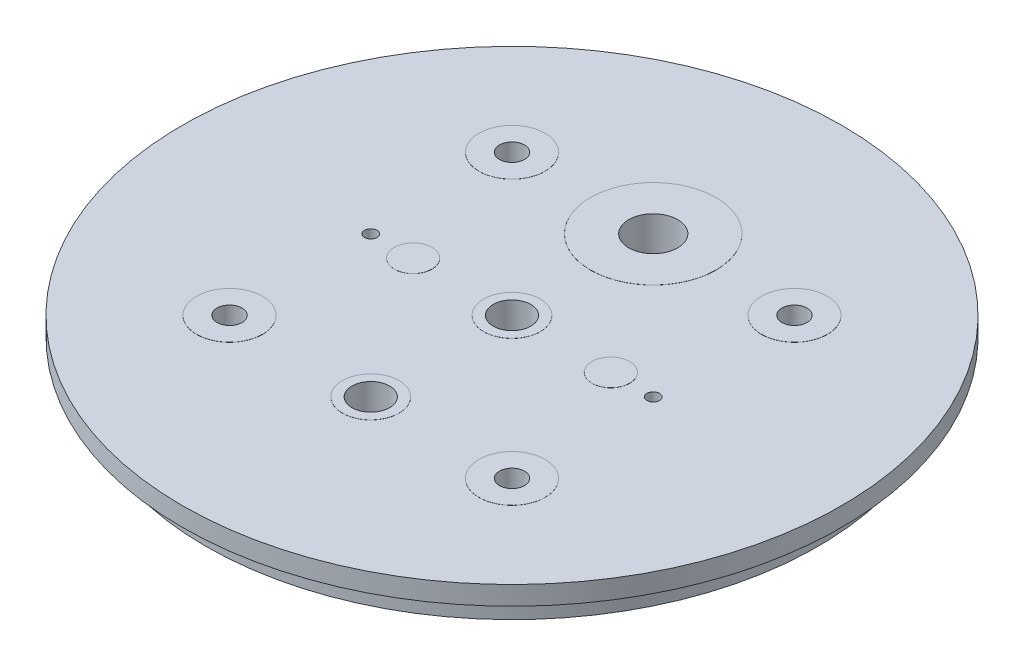
ISO-10303-21;
HEADER;
FILE_DESCRIPTION(('STEP AP214'),'2;1');
FILE_NAME('part.step','',(''),(''),'','','');
FILE_SCHEMA(('AUTOMOTIVE_DESIGN { 1 0 10303 214 1 1 1 1 }'));
ENDSEC;
DATA;
#1=APPLICATION_CONTEXT('core data for automotive mechanical design processes');
#2=APPLICATION_PROTOCOL_DEFINITION('international standard','automotive_design',2000,#1);
#3=PRODUCT_CONTEXT('',#1,'mechanical');
#4=PRODUCT('Part','Part','',(#3));
#5=PRODUCT_RELATED_PRODUCT_CATEGORY('part','',(#4));
#6=PRODUCT_DEFINITION_FORMATION('','',#4);
#7=PRODUCT_DEFINITION_CONTEXT('part definition',#1,'design');
#8=PRODUCT_DEFINITION('design','',#6,#7);
#9=PRODUCT_DEFINITION_SHAPE('','',#8);
#10=(LENGTH_UNIT() NAMED_UNIT(*) SI_UNIT(.MILLI.,.METRE.));
#11=(NAMED_UNIT(*) PLANE_ANGLE_UNIT() SI_UNIT($,.RADIAN.));
#12=(NAMED_UNIT(*) SI_UNIT($,.STERADIAN.) SOLID_ANGLE_UNIT());
#13=UNCERTAINTY_MEASURE_WITH_UNIT(LENGTH_MEASURE(1.E-05),#10,'distance_accuracy_value','');
#14=(GEOMETRIC_REPRESENTATION_CONTEXT(3) GLOBAL_UNCERTAINTY_ASSIGNED_CONTEXT((#13)) GLOBAL_UNIT_ASSIGNED_CONTEXT((#10,
#11,#12)) REPRESENTATION_CONTEXT('',''));
#15=CARTESIAN_POINT('',(0.,0.,0.));
#16=DIRECTION('',(0.,0.,1.));
#17=DIRECTION('',(1.,0.,0.));
#18=AXIS2_PLACEMENT_3D('',#15,#16,#17);
#19=CARTESIAN_POINT('',(-0.000317950413374372,18.7233240058903,10.3432985126634));
#20=DIRECTION('',(0.,-1.,0.));
#21=DIRECTION('',(0.,0.,-1.));
#22=AXIS2_PLACEMENT_3D('',#19,#20,#21);
#23=PLANE('',#22);
#24=CARTESIAN_POINT('',(22.4996823848627,18.7233240058903,-0.15670164379878));
#25=DIRECTION('',(0.,-1.,0.));
#26=DIRECTION('',(1.,0.,0.));
#27=AXIS2_PLACEMENT_3D('',#24,#25,#26);
#28=CIRCLE('',#27,2.);
#29=CARTESIAN_POINT('',(24.4996823848627,18.7233240058903,-0.15670164379878));
#30=VERTEX_POINT('',#29);
#31=EDGE_CURVE('E245',#30,#30,#28,.T.);
#32=ORIENTED_EDGE('',*,*,#31,.F.);
#33=EDGE_LOOP('',(#32));
#34=FACE_BOUND('',#33,.T.);
#35=CARTESIAN_POINT('',(22.4996823848627,18.7233240058903,22.3432986914773));
#36=DIRECTION('',(0.,-1.,0.));
#37=DIRECTION('',(1.,0.,0.));
#38=AXIS2_PLACEMENT_3D('',#35,#36,#37);
#39=CIRCLE('',#38,3.5);
#40=CARTESIAN_POINT('',(25.9996823848627,18.7233240058903,22.3432986914773));
#41=VERTEX_POINT('',#40);
#42=EDGE_CURVE('E249',#41,#41,#39,.T.);
#43=ORIENTED_EDGE('',*,*,#42,.F.);
#44=EDGE_LOOP('',(#43));
#45=FACE_BOUND('',#44,.T.);
#46=CARTESIAN_POINT('',(-22.5003182856895,18.7233240058903,22.3432986914773));
#47=DIRECTION('',(0.,-1.,0.));
#48=DIRECTION('',(1.,0.,0.));
#49=AXIS2_PLACEMENT_3D('',#46,#47,#48);
#50=CIRCLE('',#49,3.5);
#51=CARTESIAN_POINT('',(-19.0003182856895,18.7233240058903,22.3432986914773));
#52=VERTEX_POINT('',#51);
#53=EDGE_CURVE('E261',#52,#52,#50,.T.);
#54=ORIENTED_EDGE('',*,*,#53,.F.);
#55=EDGE_LOOP('',(#54));
#56=FACE_BOUND('',#55,.T.);
#57=CARTESIAN_POINT('',(-22.5003182856895,18.7233240058903,-22.6567019790749));
#58=DIRECTION('',(0.,-1.,0.));
#59=DIRECTION('',(1.,0.,0.));
#60=AXIS2_PLACEMENT_3D('',#57,#58,#59);
#61=CIRCLE('',#60,3.5);
#62=CARTESIAN_POINT('',(-19.0003182856895,18.7233240058903,-22.6567019790749));
#63=VERTEX_POINT('',#62);
#64=EDGE_CURVE('E255',#63,#63,#61,.T.);
#65=ORIENTED_EDGE('',*,*,#64,.F.);
#66=EDGE_LOOP('',(#65));
#67=FACE_BOUND('',#66,.T.);
#68=CARTESIAN_POINT('',(22.4996823848627,18.7233240058903,-22.6567019790749));
#69=DIRECTION('',(0.,-1.,0.));
#70=DIRECTION('',(1.,0.,0.));
#71=AXIS2_PLACEMENT_3D('',#68,#69,#70);
#72=CIRCLE('',#71,3.5);
#73=CARTESIAN_POINT('',(25.9996823848627,18.7233240058903,-22.6567019790749));
#74=VERTEX_POINT('',#73);
#75=EDGE_CURVE('E156',#74,#74,#72,.T.);
#76=ORIENTED_EDGE('',*,*,#75,.F.);
#77=EDGE_LOOP('',(#76));
#78=FACE_BOUND('',#77,.T.);
#79=CARTESIAN_POINT('',(-0.000317950413380542,18.7233240058903,22.3432986914773));
#80=DIRECTION('',(0.,-1.,0.));
#81=DIRECTION('',(1.,0.,0.));
#82=AXIS2_PLACEMENT_3D('',#79,#80,#81);
#83=CIRCLE('',#82,3.);
#84=CARTESIAN_POINT('',(2.99968204958662,18.7233240058903,22.3432986914773));
#85=VERTEX_POINT('',#84);
#86=EDGE_CURVE('E124',#85,#85,#83,.F.);
#87=ORIENTED_EDGE('',*,*,#86,.T.);
#88=EDGE_LOOP('',(#87));
#89=FACE_BOUND('',#88,.T.);
#90=CARTESIAN_POINT('',(-0.00031795041337055,18.7233240058903,-22.6567016437988));
#91=DIRECTION('',(0.,-1.,0.));
#92=DIRECTION('',(1.,0.,0.));
#93=AXIS2_PLACEMENT_3D('',#90,#91,#92);
#94=CIRCLE('',#93,3.9);
#95=CARTESIAN_POINT('',(3.89968204958663,18.7233240058903,-22.6567016437988));
#96=VERTEX_POINT('',#95);
#97=EDGE_CURVE('E116',#96,#96,#94,.F.);
#98=ORIENTED_EDGE('',*,*,#97,.T.);
#99=EDGE_LOOP('',(#98));
#100=FACE_BOUND('',#99,.T.);
#101=CARTESIAN_POINT('',(-0.00031795041337204,18.7233240058902,-0.15670164379878));
#102=DIRECTION('',(0.,-1.,0.));
#103=DIRECTION('',(0.,0.,1.));
#104=AXIS2_PLACEMENT_3D('',#101,#102,#103);
#105=CIRCLE('',#104,48.7499989103526);
#106=CARTESIAN_POINT('',(-0.000317950413355245,18.7233240058902,-48.9067005541514));
#107=VERTEX_POINT('',#106);
#108=EDGE_CURVE('E109',#107,#107,#105,.T.);
#109=ORIENTED_EDGE('',*,*,#108,.T.);
#110=EDGE_LOOP('',(#109));
#111=FACE_BOUND('',#110,.T.);
#112=CARTESIAN_POINT('',(-0.00031795041337204,18.7233240058903,-0.15670164379878));
#113=DIRECTION('',(0.,-1.,0.));
#114=DIRECTION('',(0.,0.,1.));
#115=AXIS2_PLACEMENT_3D('',#112,#113,#114);
#116=CIRCLE('',#115,10.5000001564622);
#117=CARTESIAN_POINT('',(-0.000317950413368423,18.7233240058903,-10.656701800261));
#118=VERTEX_POINT('',#117);
#119=EDGE_CURVE('E103',#118,#118,#116,.T.);
#120=ORIENTED_EDGE('',*,*,#119,.F.);
#121=EDGE_LOOP('',(#120));
#122=FACE_BOUND('',#121,.T.);
#123=CARTESIAN_POINT('',(-22.5003182856895,18.7233240058903,-0.15670164379878));
#124=DIRECTION('',(0.,-1.,0.));
#125=DIRECTION('',(1.,0.,0.));
#126=AXIS2_PLACEMENT_3D('',#123,#124,#125);
#127=CIRCLE('',#126,2.);
#128=CARTESIAN_POINT('',(-20.5003182856895,18.7233240058903,-0.15670164379878));
#129=VERTEX_POINT('',#128);
#130=EDGE_CURVE('E232',#129,#129,#127,.T.);
#131=ORIENTED_EDGE('',*,*,#130,.F.);
#132=EDGE_LOOP('',(#131));
#133=FACE_BOUND('',#132,.T.);
#134=ADVANCED_FACE('F45',(#34,#45,#56,#67,#78,#89,#100,#111,#122,#133),#23,.T.);
#135=CARTESIAN_POINT('',(22.4996823848627,36.2233266135934,22.3432986914773));
#136=DIRECTION('',(0.,-1.,0.));
#137=DIRECTION('',(0.,0.,-1.));
#138=AXIS2_PLACEMENT_3D('',#135,#136,#137);
#139=CYLINDRICAL_SURFACE('',#138,2.);
#140=CARTESIAN_POINT('',(22.4996823848627,26.2423537848137,22.3432986914773));
#141=DIRECTION('',(0.,-1.,0.));
#142=DIRECTION('',(1.,0.,0.));
#143=AXIS2_PLACEMENT_3D('',#140,#141,#142);
#144=CIRCLE('',#143,2.);
#145=CARTESIAN_POINT('',(24.4996823848627,26.2423537848137,22.3432986914773));
#146=VERTEX_POINT('',#145);
#147=EDGE_CURVE('E118',#146,#146,#144,.F.);
#148=ORIENTED_EDGE('',*,*,#147,.T.);
#149=EDGE_LOOP('',(#148));
#150=FACE_BOUND('',#149,.T.);
#151=CARTESIAN_POINT('',(22.4996823848627,20.7233240058903,22.3432986914773));
#152=DIRECTION('',(0.,-1.,0.));
#153=DIRECTION('',(1.,0.,0.));
#154=AXIS2_PLACEMENT_3D('',#151,#152,#153);
#155=CIRCLE('',#154,2.);
#156=CARTESIAN_POINT('',(24.4996823848627,20.7233240058903,22.3432986914773));
#157=VERTEX_POINT('',#156);
#158=EDGE_CURVE('E49',#157,#157,#155,.T.);
#159=ORIENTED_EDGE('',*,*,#158,.T.);
#160=EDGE_LOOP('',(#159));
#161=FACE_BOUND('',#160,.T.);
#162=ADVANCED_FACE('F227',(#150,#161),#139,.F.);
#163=CARTESIAN_POINT('',(-22.5003182856895,36.2233266135934,22.3432986914773));
#164=DIRECTION('',(0.,-1.,0.));
#165=DIRECTION('',(0.,0.,-1.));
#166=AXIS2_PLACEMENT_3D('',#163,#164,#165);
#167=CYLINDRICAL_SURFACE('',#166,2.);
#168=CARTESIAN_POINT('',(-22.5003182856895,26.2423537848136,22.3432986914773));
#169=DIRECTION('',(0.,-1.,0.));
#170=DIRECTION('',(1.,0.,0.));
#171=AXIS2_PLACEMENT_3D('',#168,#169,#170);
#172=CIRCLE('',#171,2.);
#173=CARTESIAN_POINT('',(-20.5003182856895,26.2423537848136,22.3432986914773));
#174=VERTEX_POINT('',#173);
#175=EDGE_CURVE('E125',#174,#174,#172,.F.);
#176=ORIENTED_EDGE('',*,*,#175,.T.);
#177=EDGE_LOOP('',(#176));
#178=FACE_BOUND('',#177,.T.);
#179=CARTESIAN_POINT('',(-22.5003182856895,20.7233240058903,22.3432986914773));
#180=DIRECTION('',(0.,-1.,0.));
#181=DIRECTION('',(1.,0.,0.));
#182=AXIS2_PLACEMENT_3D('',#179,#180,#181);
#183=CIRCLE('',#182,2.);
#184=CARTESIAN_POINT('',(-20.5003182856895,20.7233240058903,22.3432986914773));
#185=VERTEX_POINT('',#184);
#186=EDGE_CURVE('E141',#185,#185,#183,.T.);
#187=ORIENTED_EDGE('',*,*,#186,.T.);
#188=EDGE_LOOP('',(#187));
#189=FACE_BOUND('',#188,.T.);
#190=ADVANCED_FACE('F717',(#178,#189),#167,.F.);
#191=CARTESIAN_POINT('',(-22.5003182856895,36.2233266135934,-22.6567019790749));
#192=DIRECTION('',(0.,-1.,0.));
#193=DIRECTION('',(0.,0.,-1.));
#194=AXIS2_PLACEMENT_3D('',#191,#192,#193);
#195=CYLINDRICAL_SURFACE('',#194,2.);
#196=CARTESIAN_POINT('',(-22.5003182856895,26.2423537848136,-22.6567019790749));
#197=DIRECTION('',(0.,-1.,0.));
#198=DIRECTION('',(1.,0.,0.));
#199=AXIS2_PLACEMENT_3D('',#196,#197,#198);
#200=CIRCLE('',#199,2.);
#201=CARTESIAN_POINT('',(-20.5003182856895,26.2423537848136,-22.6567019790749));
#202=VERTEX_POINT('',#201);
#203=EDGE_CURVE('E128',#202,#202,#200,.F.);
#204=ORIENTED_EDGE('',*,*,#203,.T.);
#205=EDGE_LOOP('',(#204));
#206=FACE_BOUND('',#205,.T.);
#207=CARTESIAN_POINT('',(-22.5003182856895,20.7233240058903,-22.6567019790749));
#208=DIRECTION('',(0.,-1.,0.));
#209=DIRECTION('',(1.,0.,0.));
#210=AXIS2_PLACEMENT_3D('',#207,#208,#209);
#211=CIRCLE('',#210,2.);
#212=CARTESIAN_POINT('',(-20.5003182856895,20.7233240058903,-22.6567019790749));
#213=VERTEX_POINT('',#212);
#214=EDGE_CURVE('E138',#213,#213,#211,.T.);
#215=ORIENTED_EDGE('',*,*,#214,.T.);
#216=EDGE_LOOP('',(#215));
#217=FACE_BOUND('',#216,.T.);
#218=ADVANCED_FACE('F708',(#206,#217),#195,.F.);
#219=CARTESIAN_POINT('',(22.4996823848627,36.2233266135934,-22.6567019790749));
#220=DIRECTION('',(0.,-1.,0.));
#221=DIRECTION('',(0.,0.,-1.));
#222=AXIS2_PLACEMENT_3D('',#219,#220,#221);
#223=CYLINDRICAL_SURFACE('',#222,2.);
#224=CARTESIAN_POINT('',(22.4996823848627,26.2423537848137,-22.6567019790749));
#225=DIRECTION('',(0.,-1.,0.));
#226=DIRECTION('',(1.,0.,0.));
#227=AXIS2_PLACEMENT_3D('',#224,#225,#226);
#228=CIRCLE('',#227,2.);
#229=CARTESIAN_POINT('',(24.4996823848627,26.2423537848137,-22.6567019790749));
#230=VERTEX_POINT('',#229);
#231=EDGE_CURVE('E131',#230,#230,#228,.F.);
#232=ORIENTED_EDGE('',*,*,#231,.T.);
#233=EDGE_LOOP('',(#232));
#234=FACE_BOUND('',#233,.T.);
#235=CARTESIAN_POINT('',(22.4996823848627,20.7233240058903,-22.6567019790749));
#236=DIRECTION('',(0.,-1.,0.));
#237=DIRECTION('',(1.,0.,0.));
#238=AXIS2_PLACEMENT_3D('',#235,#236,#237);
#239=CIRCLE('',#238,2.);
#240=CARTESIAN_POINT('',(24.4996823848627,20.7233240058903,-22.6567019790749));
#241=VERTEX_POINT('',#240);
#242=EDGE_CURVE('E135',#241,#241,#239,.T.);
#243=ORIENTED_EDGE('',*,*,#242,.T.);
#244=EDGE_LOOP('',(#243));
#245=FACE_BOUND('',#244,.T.);
#246=ADVANCED_FACE('F308',(#234,#245),#223,.F.);
#247=CARTESIAN_POINT('',(-0.000317950413387203,26.2233266135934,52.3432991385121));
#248=DIRECTION('',(0.,1.,0.));
#249=DIRECTION('',(1.,0.,0.));
#250=AXIS2_PLACEMENT_3D('',#247,#248,#249);
#251=PLANE('',#250);
#252=CARTESIAN_POINT('',(-22.5003182856895,26.2233266135934,-0.15670164379878));
#253=DIRECTION('',(0.,1.,0.));
#254=DIRECTION('',(0.,0.,1.));
#255=AXIS2_PLACEMENT_3D('',#252,#253,#254);
#256=CIRCLE('',#255,1.);
#257=CARTESIAN_POINT('',(-22.5003182856895,26.2233266135934,0.843298356201221));
#258=VERTEX_POINT('',#257);
#259=EDGE_CURVE('E165',#258,#258,#256,.F.);
#260=ORIENTED_EDGE('',*,*,#259,.T.);
#261=EDGE_LOOP('',(#260));
#262=FACE_BOUND('',#261,.T.);
#263=CARTESIAN_POINT('',(22.4996823848627,26.2233266135934,-0.15670164379878));
#264=DIRECTION('',(0.,1.,0.));
#265=DIRECTION('',(0.,0.,1.));
#266=AXIS2_PLACEMENT_3D('',#263,#264,#265);
#267=CIRCLE('',#266,1.);
#268=CARTESIAN_POINT('',(22.4996823848627,26.2233266135934,0.843298356201221));
#269=VERTEX_POINT('',#268);
#270=EDGE_CURVE('E134',#269,#269,#267,.F.);
#271=ORIENTED_EDGE('',*,*,#270,.T.);
#272=EDGE_LOOP('',(#271));
#273=FACE_BOUND('',#272,.T.);
#274=CARTESIAN_POINT('',(-0.00031795041337055,26.2233266135934,-22.6567016437988));
#275=DIRECTION('',(0.,1.,0.));
#276=DIRECTION('',(0.,0.,1.));
#277=AXIS2_PLACEMENT_3D('',#274,#275,#276);
#278=CIRCLE('',#277,10.);
#279=CARTESIAN_POINT('',(-0.00031795041337055,26.2233266135934,-12.6567016437988));
#280=VERTEX_POINT('',#279);
#281=EDGE_CURVE('E11',#280,#280,#278,.T.);
#282=ORIENTED_EDGE('',*,*,#281,.F.);
#283=EDGE_LOOP('',(#282));
#284=FACE_BOUND('',#283,.T.);
#285=CARTESIAN_POINT('',(22.4996823848627,26.2233266135934,22.3432986914773));
#286=DIRECTION('',(0.,1.,0.));
#287=DIRECTION('',(0.,0.,1.));
#288=AXIS2_PLACEMENT_3D('',#285,#286,#287);
#289=CIRCLE('',#288,5.25);
#290=CARTESIAN_POINT('',(22.4996823848627,26.2233266135934,27.5932986914773));
#291=VERTEX_POINT('',#290);
#292=EDGE_CURVE('E55',#291,#291,#289,.T.);
#293=ORIENTED_EDGE('',*,*,#292,.F.);
#294=EDGE_LOOP('',(#293));
#295=FACE_BOUND('',#294,.T.);
#296=CARTESIAN_POINT('',(-22.5003182856895,26.2233266135934,22.3432986914773));
#297=DIRECTION('',(0.,1.,0.));
#298=DIRECTION('',(0.,0.,1.));
#299=AXIS2_PLACEMENT_3D('',#296,#297,#298);
#300=CIRCLE('',#299,5.25);
#301=CARTESIAN_POINT('',(-22.5003182856895,26.2233266135934,27.5932986914773));
#302=VERTEX_POINT('',#301);
#303=EDGE_CURVE('E195',#302,#302,#300,.T.);
#304=ORIENTED_EDGE('',*,*,#303,.F.);
#305=EDGE_LOOP('',(#304));
#306=FACE_BOUND('',#305,.T.);
#307=CARTESIAN_POINT('',(-22.5003182856895,26.2233266135934,-22.6567019790749));
#308=DIRECTION('',(0.,1.,0.));
#309=DIRECTION('',(0.,0.,1.));
#310=AXIS2_PLACEMENT_3D('',#307,#308,#309);
#311=CIRCLE('',#310,5.25);
#312=CARTESIAN_POINT('',(-22.5003182856895,26.2233266135934,-17.4067019790749));
#313=VERTEX_POINT('',#312);
#314=EDGE_CURVE('E92',#313,#313,#311,.T.);
#315=ORIENTED_EDGE('',*,*,#314,.F.);
#316=EDGE_LOOP('',(#315));
#317=FACE_BOUND('',#316,.T.);
#318=CARTESIAN_POINT('',(22.4996823848627,26.2233266135934,-22.6567019790749));
#319=DIRECTION('',(0.,1.,0.));
#320=DIRECTION('',(0.,0.,1.));
#321=AXIS2_PLACEMENT_3D('',#318,#319,#320);
#322=CIRCLE('',#321,5.25);
#323=CARTESIAN_POINT('',(22.4996823848627,26.2233266135934,-17.4067019790749));
#324=VERTEX_POINT('',#323);
#325=EDGE_CURVE('E88',#324,#324,#322,.T.);
#326=ORIENTED_EDGE('',*,*,#325,.F.);
#327=EDGE_LOOP('',(#326));
#328=FACE_BOUND('',#327,.T.);
#329=CARTESIAN_POINT('',(-0.000317950413375546,26.2233266135934,-0.15670164379878));
#330=DIRECTION('',(0.,-1.,0.));
#331=DIRECTION('',(0.,0.,1.));
#332=AXIS2_PLACEMENT_3D('',#329,#330,#331);
#333=CIRCLE('',#332,52.5000007823109);
#334=CARTESIAN_POINT('',(-0.000317950413357459,26.2233266135934,-52.6567014901305));
#335=VERTEX_POINT('',#334);
#336=EDGE_CURVE('E62',#335,#335,#333,.T.);
#337=ORIENTED_EDGE('',*,*,#336,.F.);
#338=EDGE_LOOP('',(#337));
#339=FACE_BOUND('',#338,.T.);
#340=CARTESIAN_POINT('',(-0.000317950413375546,26.2233266135934,-0.15670164379878));
#341=DIRECTION('',(0.,1.,0.));
#342=DIRECTION('',(0.,0.,1.));
#343=AXIS2_PLACEMENT_3D('',#340,#341,#342);
#344=CIRCLE('',#343,4.5);
#345=CARTESIAN_POINT('',(-0.000317950413375546,26.2233266135934,4.34329835620122));
#346=VERTEX_POINT('',#345);
#347=EDGE_CURVE('E174',#346,#346,#344,.T.);
#348=ORIENTED_EDGE('',*,*,#347,.F.);
#349=EDGE_LOOP('',(#348));
#350=FACE_BOUND('',#349,.T.);
#351=CARTESIAN_POINT('',(-0.000317950413380542,26.2233266135934,22.3432986914773));
#352=DIRECTION('',(0.,1.,0.));
#353=DIRECTION('',(0.,0.,1.));
#354=AXIS2_PLACEMENT_3D('',#351,#352,#353);
#355=CIRCLE('',#354,4.5);
#356=CARTESIAN_POINT('',(-0.000317950413380542,26.2233266135934,26.8432986914773));
#357=VERTEX_POINT('',#356);
#358=EDGE_CURVE('E198',#357,#357,#355,.T.);
#359=ORIENTED_EDGE('',*,*,#358,.F.);
#360=EDGE_LOOP('',(#359));
#361=FACE_BOUND('',#360,.T.);
#362=CARTESIAN_POINT('',(-15.7503181851067,26.2233266135934,-0.15670164379878));
#363=DIRECTION('',(0.,1.,0.));
#364=DIRECTION('',(0.,0.,1.));
#365=AXIS2_PLACEMENT_3D('',#362,#363,#364);
#366=CIRCLE('',#365,3.00000004470348);
#367=CARTESIAN_POINT('',(-15.7503181851067,26.2233266135934,2.8432984009047));
#368=VERTEX_POINT('',#367);
#369=EDGE_CURVE('E186',#368,#368,#366,.T.);
#370=ORIENTED_EDGE('',*,*,#369,.F.);
#371=EDGE_LOOP('',(#370));
#372=FACE_BOUND('',#371,.T.);
#373=CARTESIAN_POINT('',(15.7496822842799,26.2233266135934,-0.15670164379878));
#374=DIRECTION('',(0.,1.,0.));
#375=DIRECTION('',(0.,0.,1.));
#376=AXIS2_PLACEMENT_3D('',#373,#374,#375);
#377=CIRCLE('',#376,3.00000004470345);
#378=CARTESIAN_POINT('',(15.7496822842799,26.2233266135934,2.84329840090467));
#379=VERTEX_POINT('',#378);
#380=EDGE_CURVE('E180',#379,#379,#377,.T.);
#381=ORIENTED_EDGE('',*,*,#380,.F.);
#382=EDGE_LOOP('',(#381));
#383=FACE_BOUND('',#382,.T.);
#384=ADVANCED_FACE('F305',(#262,#273,#284,#295,#306,#317,#328,#339,#350,#361,#372,#383),#251,.T.);
#385=CARTESIAN_POINT('',(-0.000317950413375809,23.2233253004286,7.34329874735694));
#386=DIRECTION('',(0.,-1.,0.));
#387=DIRECTION('',(0.,0.,-1.));
#388=AXIS2_PLACEMENT_3D('',#385,#386,#387);
#389=PLANE('',#388);
#390=CARTESIAN_POINT('',(-0.000317950413374144,23.2233253004286,-0.15670164379878));
#391=DIRECTION('',(0.,1.,0.));
#392=DIRECTION('',(0.,0.,1.));
#393=AXIS2_PLACEMENT_3D('',#390,#391,#392);
#394=CIRCLE('',#393,10.5000001564622);
#395=CARTESIAN_POINT('',(-0.000317950413370526,23.2233253004286,-10.656701800261));
#396=VERTEX_POINT('',#395);
#397=EDGE_CURVE('E104',#396,#396,#394,.T.);
#398=ORIENTED_EDGE('',*,*,#397,.F.);
#399=EDGE_LOOP('',(#398));
#400=FACE_BOUND('',#399,.T.);
#401=CARTESIAN_POINT('',(-0.000317950413374144,23.2233253004286,-0.15670164379878));
#402=DIRECTION('',(0.,-1.,0.));
#403=DIRECTION('',(0.,0.,1.));
#404=AXIS2_PLACEMENT_3D('',#401,#402,#403);
#405=CIRCLE('',#404,7.50000039115572);
#406=CARTESIAN_POINT('',(-0.00031795041337156,23.2233253004286,-7.65670203495432));
#407=VERTEX_POINT('',#406);
#408=EDGE_CURVE('E98',#407,#407,#405,.T.);
#409=ORIENTED_EDGE('',*,*,#408,.F.);
#410=EDGE_LOOP('',(#409));
#411=FACE_BOUND('',#410,.T.);
#412=ADVANCED_FACE('F307',(#400,#411),#389,.T.);
#413=CARTESIAN_POINT('',(-0.000317950413369533,11.223326390076,4.34329842325644));
#414=DIRECTION('',(0.,-1.,0.));
#415=DIRECTION('',(0.,0.,-1.));
#416=AXIS2_PLACEMENT_3D('',#413,#414,#415);
#417=PLANE('',#416);
#418=CARTESIAN_POINT('',(-0.000317950413375546,11.223326390076,-0.15670164379878));
#419=DIRECTION('',(0.,1.,0.));
#420=DIRECTION('',(0.,0.,1.));
#421=AXIS2_PLACEMENT_3D('',#418,#419,#420);
#422=CIRCLE('',#421,3.);
#423=CARTESIAN_POINT('',(-0.000317950413375546,11.223326390076,2.84329835620122));
#424=VERTEX_POINT('',#423);
#425=EDGE_CURVE('E117',#424,#424,#422,.T.);
#426=ORIENTED_EDGE('',*,*,#425,.T.);
#427=EDGE_LOOP('',(#426));
#428=FACE_BOUND('',#427,.T.);
#429=CARTESIAN_POINT('',(-0.000317950413368534,11.223326390076,-0.15670164379878));
#430=DIRECTION('',(0.,-1.,0.));
#431=DIRECTION('',(0.,0.,1.));
#432=AXIS2_PLACEMENT_3D('',#429,#430,#431);
#433=CIRCLE('',#432,7.50000039115552);
#434=CARTESIAN_POINT('',(-0.00031795041336595,11.223326390076,-7.65670203495432));
#435=VERTEX_POINT('',#434);
#436=EDGE_CURVE('E83',#435,#435,#433,.T.);
#437=ORIENTED_EDGE('',*,*,#436,.T.);
#438=EDGE_LOOP('',(#437));
#439=FACE_BOUND('',#438,.T.);
#440=ADVANCED_FACE('F296',(#428,#439),#417,.T.);
#441=CARTESIAN_POINT('',(-0.000317950413374845,24.723325948629,-0.15670164379878));
#442=DIRECTION('',(0.,-1.,0.));
#443=DIRECTION('',(0.,0.,1.));
#444=AXIS2_PLACEMENT_3D('',#441,#442,#443);
#445=CYLINDRICAL_SURFACE('',#444,52.4999998463317);
#446=CARTESIAN_POINT('',(-0.000317950413374144,23.2233252836647,-0.15670164379878));
#447=DIRECTION('',(0.,-1.,0.));
#448=DIRECTION('',(0.,0.,1.));
#449=AXIS2_PLACEMENT_3D('',#446,#447,#448);
#450=CIRCLE('',#449,52.4999989103526);
#451=CARTESIAN_POINT('',(-0.000317950413356057,23.2233252836647,-52.6567014901305));
#452=VERTEX_POINT('',#451);
#453=EDGE_CURVE('E106',#452,#452,#450,.T.);
#454=ORIENTED_EDGE('',*,*,#453,.F.);
#455=DIRECTION('',(0.,1.,0.));
#456=VECTOR('',#455,1.);
#457=CARTESIAN_POINT('',(-0.000317950413356758,24.723325948629,-52.6567014901305));
#458=LINE('',#457,#456);
#459=EDGE_CURVE('E89',#452,#335,#458,.T.);
#460=ORIENTED_EDGE('',*,*,#459,.T.);
#461=ORIENTED_EDGE('',*,*,#336,.T.);
#462=ORIENTED_EDGE('',*,*,#459,.F.);
#463=EDGE_LOOP('',(#454,#460,#461,#462));
#464=FACE_BOUND('',#463,.T.);
#465=ADVANCED_FACE('F288',(#464),#445,.T.);
#466=CARTESIAN_POINT('',(-0.000317950413384968,23.2233252836647,48.5932972665538));
#467=DIRECTION('',(0.,-1.,0.));
#468=DIRECTION('',(0.,0.,-1.));
#469=AXIS2_PLACEMENT_3D('',#466,#467,#468);
#470=PLANE('',#469);
#471=ORIENTED_EDGE('',*,*,#453,.T.);
#472=EDGE_LOOP('',(#471));
#473=FACE_BOUND('',#472,.T.);
#474=CARTESIAN_POINT('',(-0.000317950413374144,23.2233252836647,-0.15670164379878));
#475=DIRECTION('',(0.,-1.,0.));
#476=DIRECTION('',(0.,0.,1.));
#477=AXIS2_PLACEMENT_3D('',#474,#475,#476);
#478=CIRCLE('',#477,48.7499989103526);
#479=CARTESIAN_POINT('',(-0.000317950413357349,23.2233252836647,-48.9067005541514));
#480=VERTEX_POINT('',#479);
#481=EDGE_CURVE('E112',#480,#480,#478,.T.);
#482=ORIENTED_EDGE('',*,*,#481,.F.);
#483=EDGE_LOOP('',(#482));
#484=FACE_BOUND('',#483,.T.);
#485=ADVANCED_FACE('F286',(#473,#484),#470,.T.);
#486=CARTESIAN_POINT('',(-0.000317950413373092,20.9733246447775,-0.15670164379878));
#487=DIRECTION('',(0.,-1.,0.));
#488=DIRECTION('',(0.,0.,1.));
#489=AXIS2_PLACEMENT_3D('',#486,#487,#488);
#490=CYLINDRICAL_SURFACE('',#489,48.7499989103526);
#491=ORIENTED_EDGE('',*,*,#108,.F.);
#492=DIRECTION('',(0.,1.,0.));
#493=VECTOR('',#492,1.);
#494=CARTESIAN_POINT('',(-0.000317950413356297,20.9733246447775,-48.9067005541514));
#495=LINE('',#494,#493);
#496=EDGE_CURVE('E217',#107,#480,#495,.T.);
#497=ORIENTED_EDGE('',*,*,#496,.T.);
#498=ORIENTED_EDGE('',*,*,#481,.T.);
#499=ORIENTED_EDGE('',*,*,#496,.F.);
#500=EDGE_LOOP('',(#491,#497,#498,#499));
#501=FACE_BOUND('',#500,.T.);
#502=ADVANCED_FACE('F284',(#501),#490,.T.);
#503=CARTESIAN_POINT('',(-0.000317950413372917,20.5983246531594,-0.15670164379878));
#504=DIRECTION('',(0.,-1.,0.));
#505=DIRECTION('',(0.,0.,1.));
#506=AXIS2_PLACEMENT_3D('',#503,#504,#505);
#507=CYLINDRICAL_SURFACE('',#506,10.5000001564622);
#508=ORIENTED_EDGE('',*,*,#119,.T.);
#509=DIRECTION('',(0.,1.,0.));
#510=VECTOR('',#509,1.);
#511=CARTESIAN_POINT('',(-0.000317950413369299,20.5983246531594,-10.656701800261));
#512=LINE('',#511,#510);
#513=EDGE_CURVE('E100',#118,#396,#512,.T.);
#514=ORIENTED_EDGE('',*,*,#513,.T.);
#515=ORIENTED_EDGE('',*,*,#397,.T.);
#516=ORIENTED_EDGE('',*,*,#513,.F.);
#517=EDGE_LOOP('',(#508,#514,#515,#516));
#518=FACE_BOUND('',#517,.T.);
#519=ADVANCED_FACE('F47',(#518),#507,.F.);
#520=CARTESIAN_POINT('',(-0.000317950413371164,16.8483258452523,-0.15670164379878));
#521=DIRECTION('',(0.,-1.,0.));
#522=DIRECTION('',(0.,0.,1.));
#523=AXIS2_PLACEMENT_3D('',#520,#521,#522);
#524=CYLINDRICAL_SURFACE('',#523,7.50000039115554);
#525=ORIENTED_EDGE('',*,*,#436,.F.);
#526=DIRECTION('',(0.,1.,0.));
#527=VECTOR('',#526,1.);
#528=CARTESIAN_POINT('',(-0.00031795041336858,16.8483258452523,-7.65670203495432));
#529=LINE('',#528,#527);
#530=EDGE_CURVE('E86',#435,#407,#529,.T.);
#531=ORIENTED_EDGE('',*,*,#530,.T.);
#532=ORIENTED_EDGE('',*,*,#408,.T.);
#533=ORIENTED_EDGE('',*,*,#530,.F.);
#534=EDGE_LOOP('',(#525,#531,#532,#533));
#535=FACE_BOUND('',#534,.T.);
#536=ADVANCED_FACE('F84',(#535),#524,.T.);
#537=CARTESIAN_POINT('',(22.4996823848627,26.2423537848137,-22.6567019790749));
#538=DIRECTION('',(0.,-1.,0.));
#539=DIRECTION('',(1.,0.,0.));
#540=AXIS2_PLACEMENT_3D('',#537,#538,#539);
#541=CYLINDRICAL_SURFACE('',#540,5.25);
#542=ORIENTED_EDGE('',*,*,#325,.T.);
#543=EDGE_LOOP('',(#542));
#544=FACE_BOUND('',#543,.T.);
#545=CARTESIAN_POINT('',(22.4996823848627,26.2423537848137,-22.6567019790749));
#546=DIRECTION('',(0.,-1.,0.));
#547=DIRECTION('',(1.,0.,0.));
#548=AXIS2_PLACEMENT_3D('',#545,#546,#547);
#549=CIRCLE('',#548,5.25);
#550=CARTESIAN_POINT('',(27.7496823848627,26.2423537848137,-22.6567019790749));
#551=VERTEX_POINT('',#550);
#552=EDGE_CURVE('E209',#551,#551,#549,.T.);
#553=ORIENTED_EDGE('',*,*,#552,.T.);
#554=EDGE_LOOP('',(#553));
#555=FACE_BOUND('',#554,.T.);
#556=ADVANCED_FACE('F301',(#544,#555),#541,.T.);
#557=CARTESIAN_POINT('',(22.4996823848627,26.2423537848137,-22.6567019790749));
#558=DIRECTION('',(0.,-1.,0.));
#559=DIRECTION('',(1.,0.,0.));
#560=AXIS2_PLACEMENT_3D('',#557,#558,#559);
#561=PLANE('',#560);
#562=ORIENTED_EDGE('',*,*,#231,.F.);
#563=EDGE_LOOP('',(#562));
#564=FACE_BOUND('',#563,.T.);
#565=ORIENTED_EDGE('',*,*,#552,.F.);
#566=EDGE_LOOP('',(#565));
#567=FACE_BOUND('',#566,.T.);
#568=ADVANCED_FACE('F365',(#564,#567),#561,.F.);
#569=CARTESIAN_POINT('',(-22.5003182856895,26.2423537848136,-22.6567019790749));
#570=DIRECTION('',(0.,-1.,0.));
#571=DIRECTION('',(1.,0.,0.));
#572=AXIS2_PLACEMENT_3D('',#569,#570,#571);
#573=CYLINDRICAL_SURFACE('',#572,5.25);
#574=ORIENTED_EDGE('',*,*,#314,.T.);
#575=EDGE_LOOP('',(#574));
#576=FACE_BOUND('',#575,.T.);
#577=CARTESIAN_POINT('',(-22.5003182856895,26.2423537848136,-22.6567019790749));
#578=DIRECTION('',(0.,-1.,0.));
#579=DIRECTION('',(1.,0.,0.));
#580=AXIS2_PLACEMENT_3D('',#577,#578,#579);
#581=CIRCLE('',#580,5.25);
#582=CARTESIAN_POINT('',(-17.2503182856895,26.2423537848136,-22.6567019790749));
#583=VERTEX_POINT('',#582);
#584=EDGE_CURVE('E204',#583,#583,#581,.T.);
#585=ORIENTED_EDGE('',*,*,#584,.T.);
#586=EDGE_LOOP('',(#585));
#587=FACE_BOUND('',#586,.T.);
#588=ADVANCED_FACE('F372',(#576,#587),#573,.T.);
#589=CARTESIAN_POINT('',(-22.5003182856895,26.2423537848136,-22.6567019790749));
#590=DIRECTION('',(0.,-1.,0.));
#591=DIRECTION('',(1.,0.,0.));
#592=AXIS2_PLACEMENT_3D('',#589,#590,#591);
#593=PLANE('',#592);
#594=ORIENTED_EDGE('',*,*,#203,.F.);
#595=EDGE_LOOP('',(#594));
#596=FACE_BOUND('',#595,.T.);
#597=ORIENTED_EDGE('',*,*,#584,.F.);
#598=EDGE_LOOP('',(#597));
#599=FACE_BOUND('',#598,.T.);
#600=ADVANCED_FACE('F377',(#596,#599),#593,.F.);
#601=CARTESIAN_POINT('',(-22.5003182856895,26.2423537848136,22.3432986914773));
#602=DIRECTION('',(0.,-1.,0.));
#603=DIRECTION('',(1.,0.,0.));
#604=AXIS2_PLACEMENT_3D('',#601,#602,#603);
#605=CYLINDRICAL_SURFACE('',#604,5.25);
#606=ORIENTED_EDGE('',*,*,#303,.T.);
#607=EDGE_LOOP('',(#606));
#608=FACE_BOUND('',#607,.T.);
#609=CARTESIAN_POINT('',(-22.5003182856895,26.2423537848136,22.3432986914773));
#610=DIRECTION('',(0.,-1.,0.));
#611=DIRECTION('',(1.,0.,0.));
#612=AXIS2_PLACEMENT_3D('',#609,#610,#611);
#613=CIRCLE('',#612,5.25);
#614=CARTESIAN_POINT('',(-17.2503182856895,26.2423537848136,22.3432986914773));
#615=VERTEX_POINT('',#614);
#616=EDGE_CURVE('E201',#615,#615,#613,.T.);
#617=ORIENTED_EDGE('',*,*,#616,.T.);
#618=EDGE_LOOP('',(#617));
#619=FACE_BOUND('',#618,.T.);
#620=ADVANCED_FACE('F385',(#608,#619),#605,.T.);
#621=CARTESIAN_POINT('',(-22.5003182856895,26.2423537848136,22.3432986914773));
#622=DIRECTION('',(0.,-1.,0.));
#623=DIRECTION('',(1.,0.,0.));
#624=AXIS2_PLACEMENT_3D('',#621,#622,#623);
#625=PLANE('',#624);
#626=ORIENTED_EDGE('',*,*,#175,.F.);
#627=EDGE_LOOP('',(#626));
#628=FACE_BOUND('',#627,.T.);
#629=ORIENTED_EDGE('',*,*,#616,.F.);
#630=EDGE_LOOP('',(#629));
#631=FACE_BOUND('',#630,.T.);
#632=ADVANCED_FACE('F390',(#628,#631),#625,.F.);
#633=CARTESIAN_POINT('',(-0.000317950413380551,26.2423537848136,22.3432986914773));
#634=DIRECTION('',(0.,-1.,0.));
#635=DIRECTION('',(1.,0.,0.));
#636=AXIS2_PLACEMENT_3D('',#633,#634,#635);
#637=CYLINDRICAL_SURFACE('',#636,4.5);
#638=ORIENTED_EDGE('',*,*,#358,.T.);
#639=EDGE_LOOP('',(#638));
#640=FACE_BOUND('',#639,.T.);
#641=CARTESIAN_POINT('',(-0.000317950413380551,26.2423537848136,22.3432986914773));
#642=DIRECTION('',(0.,-1.,0.));
#643=DIRECTION('',(1.,0.,0.));
#644=AXIS2_PLACEMENT_3D('',#641,#642,#643);
#645=CIRCLE('',#644,4.5);
#646=CARTESIAN_POINT('',(4.49968204958662,26.2423537848136,22.3432986914773));
#647=VERTEX_POINT('',#646);
#648=EDGE_CURVE('E192',#647,#647,#645,.T.);
#649=ORIENTED_EDGE('',*,*,#648,.T.);
#650=EDGE_LOOP('',(#649));
#651=FACE_BOUND('',#650,.T.);
#652=ADVANCED_FACE('F398',(#640,#651),#637,.T.);
#653=CARTESIAN_POINT('',(-0.000317950413380551,26.2423537848136,22.3432986914773));
#654=DIRECTION('',(0.,-1.,0.));
#655=DIRECTION('',(1.,0.,0.));
#656=AXIS2_PLACEMENT_3D('',#653,#654,#655);
#657=PLANE('',#656);
#658=CARTESIAN_POINT('',(-0.000317950413380542,26.2423537848136,22.3432986914773));
#659=DIRECTION('',(0.,-1.,0.));
#660=DIRECTION('',(1.,0.,0.));
#661=AXIS2_PLACEMENT_3D('',#658,#659,#660);
#662=CIRCLE('',#661,3.);
#663=CARTESIAN_POINT('',(2.99968204958662,26.2423537848136,22.3432986914773));
#664=VERTEX_POINT('',#663);
#665=EDGE_CURVE('E121',#664,#664,#662,.F.);
#666=ORIENTED_EDGE('',*,*,#665,.F.);
#667=EDGE_LOOP('',(#666));
#668=FACE_BOUND('',#667,.T.);
#669=ORIENTED_EDGE('',*,*,#648,.F.);
#670=EDGE_LOOP('',(#669));
#671=FACE_BOUND('',#670,.T.);
#672=ADVANCED_FACE('F403',(#668,#671),#657,.F.);
#673=CARTESIAN_POINT('',(22.4996823848627,26.2423537848137,22.3432986914773));
#674=DIRECTION('',(0.,-1.,0.));
#675=DIRECTION('',(1.,0.,0.));
#676=AXIS2_PLACEMENT_3D('',#673,#674,#675);
#677=CYLINDRICAL_SURFACE('',#676,5.25);
#678=ORIENTED_EDGE('',*,*,#292,.T.);
#679=EDGE_LOOP('',(#678));
#680=FACE_BOUND('',#679,.T.);
#681=CARTESIAN_POINT('',(22.4996823848627,26.2423537848137,22.3432986914773));
#682=DIRECTION('',(0.,-1.,0.));
#683=DIRECTION('',(1.,0.,0.));
#684=AXIS2_PLACEMENT_3D('',#681,#682,#683);
#685=CIRCLE('',#684,5.25);
#686=CARTESIAN_POINT('',(27.7496823848627,26.2423537848137,22.3432986914773));
#687=VERTEX_POINT('',#686);
#688=EDGE_CURVE('E189',#687,#687,#685,.T.);
#689=ORIENTED_EDGE('',*,*,#688,.T.);
#690=EDGE_LOOP('',(#689));
#691=FACE_BOUND('',#690,.T.);
#692=ADVANCED_FACE('F411',(#680,#691),#677,.T.);
#693=CARTESIAN_POINT('',(22.4996823848627,26.2423537848137,22.3432986914773));
#694=DIRECTION('',(0.,-1.,0.));
#695=DIRECTION('',(1.,0.,0.));
#696=AXIS2_PLACEMENT_3D('',#693,#694,#695);
#697=PLANE('',#696);
#698=ORIENTED_EDGE('',*,*,#147,.F.);
#699=EDGE_LOOP('',(#698));
#700=FACE_BOUND('',#699,.T.);
#701=ORIENTED_EDGE('',*,*,#688,.F.);
#702=EDGE_LOOP('',(#701));
#703=FACE_BOUND('',#702,.T.);
#704=ADVANCED_FACE('F416',(#700,#703),#697,.F.);
#705=CARTESIAN_POINT('',(-15.7503181851067,26.2423537848136,-0.15670164379878));
#706=DIRECTION('',(0.,-1.,0.));
#707=DIRECTION('',(1.,0.,0.));
#708=AXIS2_PLACEMENT_3D('',#705,#706,#707);
#709=CYLINDRICAL_SURFACE('',#708,3.00000004470348);
#710=ORIENTED_EDGE('',*,*,#369,.T.);
#711=EDGE_LOOP('',(#710));
#712=FACE_BOUND('',#711,.T.);
#713=CARTESIAN_POINT('',(-15.7503181851067,26.2423537848136,-0.15670164379878));
#714=DIRECTION('',(0.,-1.,0.));
#715=DIRECTION('',(1.,0.,0.));
#716=AXIS2_PLACEMENT_3D('',#713,#714,#715);
#717=CIRCLE('',#716,3.00000004470348);
#718=CARTESIAN_POINT('',(-12.7503181404032,26.2423537848136,-0.15670164379878));
#719=VERTEX_POINT('',#718);
#720=EDGE_CURVE('E183',#719,#719,#717,.T.);
#721=ORIENTED_EDGE('',*,*,#720,.T.);
#722=EDGE_LOOP('',(#721));
#723=FACE_BOUND('',#722,.T.);
#724=ADVANCED_FACE('F424',(#712,#723),#709,.T.);
#725=CARTESIAN_POINT('',(-15.7503181851067,26.2423537848136,-0.15670164379878));
#726=DIRECTION('',(0.,-1.,0.));
#727=DIRECTION('',(1.,0.,0.));
#728=AXIS2_PLACEMENT_3D('',#725,#726,#727);
#729=PLANE('',#728);
#730=ORIENTED_EDGE('',*,*,#720,.F.);
#731=EDGE_LOOP('',(#730));
#732=FACE_BOUND('',#731,.T.);
#733=ADVANCED_FACE('F429',(#732),#729,.F.);
#734=CARTESIAN_POINT('',(15.7496822842799,26.2423537848136,-0.15670164379878));
#735=DIRECTION('',(0.,-1.,0.));
#736=DIRECTION('',(1.,0.,0.));
#737=AXIS2_PLACEMENT_3D('',#734,#735,#736);
#738=CYLINDRICAL_SURFACE('',#737,3.00000004470345);
#739=ORIENTED_EDGE('',*,*,#380,.T.);
#740=EDGE_LOOP('',(#739));
#741=FACE_BOUND('',#740,.T.);
#742=CARTESIAN_POINT('',(15.7496822842799,26.2423537848136,-0.15670164379878));
#743=DIRECTION('',(0.,-1.,0.));
#744=DIRECTION('',(1.,0.,0.));
#745=AXIS2_PLACEMENT_3D('',#742,#743,#744);
#746=CIRCLE('',#745,3.00000004470345);
#747=CARTESIAN_POINT('',(18.7496823289834,26.2423537848136,-0.15670164379878));
#748=VERTEX_POINT('',#747);
#749=EDGE_CURVE('E177',#748,#748,#746,.T.);
#750=ORIENTED_EDGE('',*,*,#749,.T.);
#751=EDGE_LOOP('',(#750));
#752=FACE_BOUND('',#751,.T.);
#753=ADVANCED_FACE('F439',(#741,#752),#738,.T.);
#754=CARTESIAN_POINT('',(15.7496822842799,26.2423537848136,-0.15670164379878));
#755=DIRECTION('',(0.,-1.,0.));
#756=DIRECTION('',(1.,0.,0.));
#757=AXIS2_PLACEMENT_3D('',#754,#755,#756);
#758=PLANE('',#757);
#759=ORIENTED_EDGE('',*,*,#749,.F.);
#760=EDGE_LOOP('',(#759));
#761=FACE_BOUND('',#760,.T.);
#762=ADVANCED_FACE('F449',(#761),#758,.F.);
#763=CARTESIAN_POINT('',(-0.000317950413375555,26.2423537848136,-0.15670164379878));
#764=DIRECTION('',(0.,-1.,0.));
#765=DIRECTION('',(1.,0.,0.));
#766=AXIS2_PLACEMENT_3D('',#763,#764,#765);
#767=CYLINDRICAL_SURFACE('',#766,4.5);
#768=ORIENTED_EDGE('',*,*,#347,.T.);
#769=EDGE_LOOP('',(#768));
#770=FACE_BOUND('',#769,.T.);
#771=CARTESIAN_POINT('',(-0.000317950413375555,26.2423537848136,-0.15670164379878));
#772=DIRECTION('',(0.,-1.,0.));
#773=DIRECTION('',(1.,0.,0.));
#774=AXIS2_PLACEMENT_3D('',#771,#772,#773);
#775=CIRCLE('',#774,4.5);
#776=CARTESIAN_POINT('',(4.49968204958662,26.2423537848136,-0.15670164379878));
#777=VERTEX_POINT('',#776);
#778=EDGE_CURVE('E170',#777,#777,#775,.T.);
#779=ORIENTED_EDGE('',*,*,#778,.T.);
#780=EDGE_LOOP('',(#779));
#781=FACE_BOUND('',#780,.T.);
#782=ADVANCED_FACE('F459',(#770,#781),#767,.T.);
#783=CARTESIAN_POINT('',(-0.000317950413375555,26.2423537848136,-0.15670164379878));
#784=DIRECTION('',(0.,-1.,0.));
#785=DIRECTION('',(1.,0.,0.));
#786=AXIS2_PLACEMENT_3D('',#783,#784,#785);
#787=PLANE('',#786);
#788=CARTESIAN_POINT('',(-0.000317950413375546,26.2423537848137,-0.15670164379878));
#789=DIRECTION('',(0.,1.,0.));
#790=DIRECTION('',(0.,0.,1.));
#791=AXIS2_PLACEMENT_3D('',#788,#789,#790);
#792=CIRCLE('',#791,3.);
#793=CARTESIAN_POINT('',(-0.000317950413375546,26.2423537848137,2.84329835620122));
#794=VERTEX_POINT('',#793);
#795=EDGE_CURVE('E146',#794,#794,#792,.T.);
#796=ORIENTED_EDGE('',*,*,#795,.F.);
#797=EDGE_LOOP('',(#796));
#798=FACE_BOUND('',#797,.T.);
#799=ORIENTED_EDGE('',*,*,#778,.F.);
#800=EDGE_LOOP('',(#799));
#801=FACE_BOUND('',#800,.T.);
#802=ADVANCED_FACE('F469',(#798,#801),#787,.F.);
#803=CARTESIAN_POINT('',(-0.000317950413370559,26.2423537848136,-22.6567016437988));
#804=DIRECTION('',(0.,-1.,0.));
#805=DIRECTION('',(1.,0.,0.));
#806=AXIS2_PLACEMENT_3D('',#803,#804,#805);
#807=PLANE('',#806);
#808=CARTESIAN_POINT('',(-0.00031795041337055,26.2423537848136,-22.6567016437988));
#809=DIRECTION('',(0.,-1.,0.));
#810=DIRECTION('',(1.,0.,0.));
#811=AXIS2_PLACEMENT_3D('',#808,#809,#810);
#812=CIRCLE('',#811,3.9);
#813=CARTESIAN_POINT('',(3.89968204958663,26.2423537848136,-22.6567016437988));
#814=VERTEX_POINT('',#813);
#815=EDGE_CURVE('E113',#814,#814,#812,.F.);
#816=ORIENTED_EDGE('',*,*,#815,.F.);
#817=EDGE_LOOP('',(#816));
#818=FACE_BOUND('',#817,.T.);
#819=CARTESIAN_POINT('',(-0.000317950413370559,26.2423537848136,-22.6567016437988));
#820=DIRECTION('',(0.,-1.,0.));
#821=DIRECTION('',(1.,0.,0.));
#822=AXIS2_PLACEMENT_3D('',#819,#820,#821);
#823=CIRCLE('',#822,10.);
#824=CARTESIAN_POINT('',(9.99968204958663,26.2423537848136,-22.6567016437988));
#825=VERTEX_POINT('',#824);
#826=EDGE_CURVE('E168',#825,#825,#823,.T.);
#827=ORIENTED_EDGE('',*,*,#826,.F.);
#828=EDGE_LOOP('',(#827));
#829=FACE_BOUND('',#828,.T.);
#830=ADVANCED_FACE('F482',(#818,#829),#807,.F.);
#831=CARTESIAN_POINT('',(-0.000317950413370559,26.2423537848136,-22.6567016437988));
#832=DIRECTION('',(0.,-1.,0.));
#833=DIRECTION('',(1.,0.,0.));
#834=AXIS2_PLACEMENT_3D('',#831,#832,#833);
#835=CYLINDRICAL_SURFACE('',#834,10.);
#836=ORIENTED_EDGE('',*,*,#281,.T.);
#837=EDGE_LOOP('',(#836));
#838=FACE_BOUND('',#837,.T.);
#839=ORIENTED_EDGE('',*,*,#826,.T.);
#840=EDGE_LOOP('',(#839));
#841=FACE_BOUND('',#840,.T.);
#842=ADVANCED_FACE('F477',(#838,#841),#835,.T.);
#843=CARTESIAN_POINT('',(-0.00031795041337055,36.2233266135934,-22.6567016437988));
#844=DIRECTION('',(0.,-1.,0.));
#845=DIRECTION('',(0.,0.,-1.));
#846=AXIS2_PLACEMENT_3D('',#843,#844,#845);
#847=CYLINDRICAL_SURFACE('',#846,3.9);
#848=ORIENTED_EDGE('',*,*,#97,.F.);
#849=EDGE_LOOP('',(#848));
#850=FACE_BOUND('',#849,.T.);
#851=ORIENTED_EDGE('',*,*,#815,.T.);
#852=EDGE_LOOP('',(#851));
#853=FACE_BOUND('',#852,.T.);
#854=ADVANCED_FACE('F481',(#850,#853),#847,.F.);
#855=CARTESIAN_POINT('',(-0.000317950413380542,36.2233266135934,22.3432986914773));
#856=DIRECTION('',(0.,-1.,0.));
#857=DIRECTION('',(0.,0.,-1.));
#858=AXIS2_PLACEMENT_3D('',#855,#856,#857);
#859=CYLINDRICAL_SURFACE('',#858,3.);
#860=ORIENTED_EDGE('',*,*,#86,.F.);
#861=EDGE_LOOP('',(#860));
#862=FACE_BOUND('',#861,.T.);
#863=ORIENTED_EDGE('',*,*,#665,.T.);
#864=EDGE_LOOP('',(#863));
#865=FACE_BOUND('',#864,.T.);
#866=ADVANCED_FACE('F538',(#862,#865),#859,.F.);
#867=CARTESIAN_POINT('',(22.4996823848627,36.2233266135934,-0.15670164379878));
#868=DIRECTION('',(0.,-1.,0.));
#869=DIRECTION('',(0.,0.,-1.));
#870=AXIS2_PLACEMENT_3D('',#867,#868,#869);
#871=CYLINDRICAL_SURFACE('',#870,1.);
#872=ORIENTED_EDGE('',*,*,#270,.F.);
#873=EDGE_LOOP('',(#872));
#874=FACE_BOUND('',#873,.T.);
#875=CARTESIAN_POINT('',(22.4996823848627,14.7233240058903,-0.15670164379878));
#876=DIRECTION('',(0.,-1.,0.));
#877=DIRECTION('',(1.,0.,0.));
#878=AXIS2_PLACEMENT_3D('',#875,#876,#877);
#879=CIRCLE('',#878,1.);
#880=CARTESIAN_POINT('',(23.4996823848627,14.7233240058903,-0.15670164379878));
#881=VERTEX_POINT('',#880);
#882=EDGE_CURVE('E238',#881,#881,#879,.T.);
#883=ORIENTED_EDGE('',*,*,#882,.T.);
#884=EDGE_LOOP('',(#883));
#885=FACE_BOUND('',#884,.T.);
#886=ADVANCED_FACE('F547',(#874,#885),#871,.F.);
#887=CARTESIAN_POINT('',(-22.5003182856895,36.2233266135934,-0.15670164379878));
#888=DIRECTION('',(0.,-1.,0.));
#889=DIRECTION('',(0.,0.,-1.));
#890=AXIS2_PLACEMENT_3D('',#887,#888,#889);
#891=CYLINDRICAL_SURFACE('',#890,1.);
#892=ORIENTED_EDGE('',*,*,#259,.F.);
#893=EDGE_LOOP('',(#892));
#894=FACE_BOUND('',#893,.T.);
#895=CARTESIAN_POINT('',(-22.5003182856895,14.7233240058903,-0.15670164379878));
#896=DIRECTION('',(0.,-1.,0.));
#897=DIRECTION('',(1.,0.,0.));
#898=AXIS2_PLACEMENT_3D('',#895,#896,#897);
#899=CIRCLE('',#898,1.);
#900=CARTESIAN_POINT('',(-21.5003182856895,14.7233240058903,-0.15670164379878));
#901=VERTEX_POINT('',#900);
#902=EDGE_CURVE('E235',#901,#901,#899,.T.);
#903=ORIENTED_EDGE('',*,*,#902,.T.);
#904=EDGE_LOOP('',(#903));
#905=FACE_BOUND('',#904,.T.);
#906=ADVANCED_FACE('F559',(#894,#905),#891,.F.);
#907=CARTESIAN_POINT('',(-0.000317950413375546,11.223326390076,-0.15670164379878));
#908=DIRECTION('',(0.,1.,0.));
#909=DIRECTION('',(0.,0.,1.));
#910=AXIS2_PLACEMENT_3D('',#907,#908,#909);
#911=CYLINDRICAL_SURFACE('',#910,3.);
#912=ORIENTED_EDGE('',*,*,#425,.F.);
#913=EDGE_LOOP('',(#912));
#914=FACE_BOUND('',#913,.T.);
#915=ORIENTED_EDGE('',*,*,#795,.T.);
#916=EDGE_LOOP('',(#915));
#917=FACE_BOUND('',#916,.T.);
#918=ADVANCED_FACE('F555',(#914,#917),#911,.F.);
#919=CARTESIAN_POINT('',(22.4996823848627,20.7233240058903,-22.6567019790749));
#920=DIRECTION('',(0.,-1.,0.));
#921=DIRECTION('',(1.,0.,0.));
#922=AXIS2_PLACEMENT_3D('',#919,#920,#921);
#923=CYLINDRICAL_SURFACE('',#922,3.5);
#924=CARTESIAN_POINT('',(22.4996823848627,20.7233240058903,-22.6567019790749));
#925=DIRECTION('',(0.,-1.,0.));
#926=DIRECTION('',(1.,0.,0.));
#927=AXIS2_PLACEMENT_3D('',#924,#925,#926);
#928=CIRCLE('',#927,3.5);
#929=CARTESIAN_POINT('',(25.9996823848627,20.7233240058903,-22.6567019790749));
#930=VERTEX_POINT('',#929);
#931=EDGE_CURVE('E139',#930,#930,#928,.T.);
#932=ORIENTED_EDGE('',*,*,#931,.F.);
#933=EDGE_LOOP('',(#932));
#934=FACE_BOUND('',#933,.T.);
#935=ORIENTED_EDGE('',*,*,#75,.T.);
#936=EDGE_LOOP('',(#935));
#937=FACE_BOUND('',#936,.T.);
#938=ADVANCED_FACE('F274',(#934,#937),#923,.F.);
#939=CARTESIAN_POINT('',(22.4996823848627,20.7233240058903,-22.6567019790749));
#940=DIRECTION('',(0.,-1.,0.));
#941=DIRECTION('',(1.,0.,0.));
#942=AXIS2_PLACEMENT_3D('',#939,#940,#941);
#943=PLANE('',#942);
#944=ORIENTED_EDGE('',*,*,#242,.F.);
#945=EDGE_LOOP('',(#944));
#946=FACE_BOUND('',#945,.T.);
#947=ORIENTED_EDGE('',*,*,#931,.T.);
#948=EDGE_LOOP('',(#947));
#949=FACE_BOUND('',#948,.T.);
#950=ADVANCED_FACE('F568',(#946,#949),#943,.T.);
#951=CARTESIAN_POINT('',(-22.5003182856895,20.7233240058903,-22.6567019790749));
#952=DIRECTION('',(0.,-1.,0.));
#953=DIRECTION('',(1.,0.,0.));
#954=AXIS2_PLACEMENT_3D('',#951,#952,#953);
#955=CYLINDRICAL_SURFACE('',#954,3.5);
#956=CARTESIAN_POINT('',(-22.5003182856895,20.7233240058903,-22.6567019790749));
#957=DIRECTION('',(0.,-1.,0.));
#958=DIRECTION('',(1.,0.,0.));
#959=AXIS2_PLACEMENT_3D('',#956,#957,#958);
#960=CIRCLE('',#959,3.5);
#961=CARTESIAN_POINT('',(-19.0003182856895,20.7233240058903,-22.6567019790749));
#962=VERTEX_POINT('',#961);
#963=EDGE_CURVE('E252',#962,#962,#960,.T.);
#964=ORIENTED_EDGE('',*,*,#963,.F.);
#965=EDGE_LOOP('',(#964));
#966=FACE_BOUND('',#965,.T.);
#967=ORIENTED_EDGE('',*,*,#64,.T.);
#968=EDGE_LOOP('',(#967));
#969=FACE_BOUND('',#968,.T.);
#970=ADVANCED_FACE('F577',(#966,#969),#955,.F.);
#971=CARTESIAN_POINT('',(-22.5003182856895,20.7233240058903,-22.6567019790749));
#972=DIRECTION('',(0.,-1.,0.));
#973=DIRECTION('',(1.,0.,0.));
#974=AXIS2_PLACEMENT_3D('',#971,#972,#973);
#975=PLANE('',#974);
#976=ORIENTED_EDGE('',*,*,#214,.F.);
#977=EDGE_LOOP('',(#976));
#978=FACE_BOUND('',#977,.T.);
#979=ORIENTED_EDGE('',*,*,#963,.T.);
#980=EDGE_LOOP('',(#979));
#981=FACE_BOUND('',#980,.T.);
#982=ADVANCED_FACE('F585',(#978,#981),#975,.T.);
#983=CARTESIAN_POINT('',(-22.5003182856895,20.7233240058903,22.3432986914773));
#984=DIRECTION('',(0.,-1.,0.));
#985=DIRECTION('',(1.,0.,0.));
#986=AXIS2_PLACEMENT_3D('',#983,#984,#985);
#987=CYLINDRICAL_SURFACE('',#986,3.5);
#988=CARTESIAN_POINT('',(-22.5003182856895,20.7233240058903,22.3432986914773));
#989=DIRECTION('',(0.,-1.,0.));
#990=DIRECTION('',(1.,0.,0.));
#991=AXIS2_PLACEMENT_3D('',#988,#989,#990);
#992=CIRCLE('',#991,3.5);
#993=CARTESIAN_POINT('',(-19.0003182856895,20.7233240058903,22.3432986914773));
#994=VERTEX_POINT('',#993);
#995=EDGE_CURVE('E258',#994,#994,#992,.T.);
#996=ORIENTED_EDGE('',*,*,#995,.F.);
#997=EDGE_LOOP('',(#996));
#998=FACE_BOUND('',#997,.T.);
#999=ORIENTED_EDGE('',*,*,#53,.T.);
#1000=EDGE_LOOP('',(#999));
#1001=FACE_BOUND('',#1000,.T.);
#1002=ADVANCED_FACE('F593',(#998,#1001),#987,.F.);
#1003=CARTESIAN_POINT('',(-22.5003182856895,20.7233240058903,22.3432986914773));
#1004=DIRECTION('',(0.,-1.,0.));
#1005=DIRECTION('',(1.,0.,0.));
#1006=AXIS2_PLACEMENT_3D('',#1003,#1004,#1005);
#1007=PLANE('',#1006);
#1008=ORIENTED_EDGE('',*,*,#186,.F.);
#1009=EDGE_LOOP('',(#1008));
#1010=FACE_BOUND('',#1009,.T.);
#1011=ORIENTED_EDGE('',*,*,#995,.T.);
#1012=EDGE_LOOP('',(#1011));
#1013=FACE_BOUND('',#1012,.T.);
#1014=ADVANCED_FACE('F601',(#1010,#1013),#1007,.T.);
#1015=CARTESIAN_POINT('',(22.4996823848627,20.7233240058903,22.3432986914773));
#1016=DIRECTION('',(0.,-1.,0.));
#1017=DIRECTION('',(1.,0.,0.));
#1018=AXIS2_PLACEMENT_3D('',#1015,#1016,#1017);
#1019=CYLINDRICAL_SURFACE('',#1018,3.5);
#1020=CARTESIAN_POINT('',(22.4996823848627,20.7233240058903,22.3432986914773));
#1021=DIRECTION('',(0.,-1.,0.));
#1022=DIRECTION('',(1.,0.,0.));
#1023=AXIS2_PLACEMENT_3D('',#1020,#1021,#1022);
#1024=CIRCLE('',#1023,3.5);
#1025=CARTESIAN_POINT('',(25.9996823848627,20.7233240058903,22.3432986914773));
#1026=VERTEX_POINT('',#1025);
#1027=EDGE_CURVE('E264',#1026,#1026,#1024,.T.);
#1028=ORIENTED_EDGE('',*,*,#1027,.F.);
#1029=EDGE_LOOP('',(#1028));
#1030=FACE_BOUND('',#1029,.T.);
#1031=ORIENTED_EDGE('',*,*,#42,.T.);
#1032=EDGE_LOOP('',(#1031));
#1033=FACE_BOUND('',#1032,.T.);
#1034=ADVANCED_FACE('F609',(#1030,#1033),#1019,.F.);
#1035=CARTESIAN_POINT('',(22.4996823848627,20.7233240058903,22.3432986914773));
#1036=DIRECTION('',(0.,-1.,0.));
#1037=DIRECTION('',(1.,0.,0.));
#1038=AXIS2_PLACEMENT_3D('',#1035,#1036,#1037);
#1039=PLANE('',#1038);
#1040=ORIENTED_EDGE('',*,*,#158,.F.);
#1041=EDGE_LOOP('',(#1040));
#1042=FACE_BOUND('',#1041,.T.);
#1043=ORIENTED_EDGE('',*,*,#1027,.T.);
#1044=EDGE_LOOP('',(#1043));
#1045=FACE_BOUND('',#1044,.T.);
#1046=ADVANCED_FACE('F617',(#1042,#1045),#1039,.T.);
#1047=CARTESIAN_POINT('',(22.4996823848627,14.7233240058903,-0.15670164379878));
#1048=DIRECTION('',(0.,-1.,0.));
#1049=DIRECTION('',(1.,0.,0.));
#1050=AXIS2_PLACEMENT_3D('',#1047,#1048,#1049);
#1051=PLANE('',#1050);
#1052=CARTESIAN_POINT('',(22.4996823848627,14.7233240058903,-0.15670164379878));
#1053=DIRECTION('',(0.,-1.,0.));
#1054=DIRECTION('',(1.,0.,0.));
#1055=AXIS2_PLACEMENT_3D('',#1052,#1053,#1054);
#1056=CIRCLE('',#1055,2.);
#1057=CARTESIAN_POINT('',(24.4996823848627,14.7233240058903,-0.15670164379878));
#1058=VERTEX_POINT('',#1057);
#1059=EDGE_CURVE('E246',#1058,#1058,#1056,.T.);
#1060=ORIENTED_EDGE('',*,*,#1059,.T.);
#1061=EDGE_LOOP('',(#1060));
#1062=FACE_BOUND('',#1061,.T.);
#1063=ORIENTED_EDGE('',*,*,#882,.F.);
#1064=EDGE_LOOP('',(#1063));
#1065=FACE_BOUND('',#1064,.T.);
#1066=ADVANCED_FACE('F625',(#1062,#1065),#1051,.T.);
#1067=CARTESIAN_POINT('',(22.4996823848627,14.7233240058903,-0.15670164379878));
#1068=DIRECTION('',(0.,1.,0.));
#1069=DIRECTION('',(-1.,0.,0.));
#1070=AXIS2_PLACEMENT_3D('',#1067,#1068,#1069);
#1071=CYLINDRICAL_SURFACE('',#1070,2.);
#1072=ORIENTED_EDGE('',*,*,#1059,.F.);
#1073=EDGE_LOOP('',(#1072));
#1074=FACE_BOUND('',#1073,.T.);
#1075=ORIENTED_EDGE('',*,*,#31,.T.);
#1076=EDGE_LOOP('',(#1075));
#1077=FACE_BOUND('',#1076,.T.);
#1078=ADVANCED_FACE('F654',(#1074,#1077),#1071,.T.);
#1079=CARTESIAN_POINT('',(-22.5003182856895,14.7233240058903,-0.15670164379878));
#1080=DIRECTION('',(0.,-1.,0.));
#1081=DIRECTION('',(1.,0.,0.));
#1082=AXIS2_PLACEMENT_3D('',#1079,#1080,#1081);
#1083=PLANE('',#1082);
#1084=CARTESIAN_POINT('',(-22.5003182856895,14.7233240058903,-0.15670164379878));
#1085=DIRECTION('',(0.,-1.,0.));
#1086=DIRECTION('',(1.,0.,0.));
#1087=AXIS2_PLACEMENT_3D('',#1084,#1085,#1086);
#1088=CIRCLE('',#1087,2.);
#1089=CARTESIAN_POINT('',(-20.5003182856895,14.7233240058903,-0.15670164379878));
#1090=VERTEX_POINT('',#1089);
#1091=EDGE_CURVE('E234',#1090,#1090,#1088,.T.);
#1092=ORIENTED_EDGE('',*,*,#1091,.T.);
#1093=EDGE_LOOP('',(#1092));
#1094=FACE_BOUND('',#1093,.T.);
#1095=ORIENTED_EDGE('',*,*,#902,.F.);
#1096=EDGE_LOOP('',(#1095));
#1097=FACE_BOUND('',#1096,.T.);
#1098=ADVANCED_FACE('F662',(#1094,#1097),#1083,.T.);
#1099=CARTESIAN_POINT('',(-22.5003182856895,14.7233240058903,-0.15670164379878));
#1100=DIRECTION('',(0.,1.,0.));
#1101=DIRECTION('',(-1.,0.,0.));
#1102=AXIS2_PLACEMENT_3D('',#1099,#1100,#1101);
#1103=CYLINDRICAL_SURFACE('',#1102,2.);
#1104=ORIENTED_EDGE('',*,*,#1091,.F.);
#1105=EDGE_LOOP('',(#1104));
#1106=FACE_BOUND('',#1105,.T.);
#1107=ORIENTED_EDGE('',*,*,#130,.T.);
#1108=EDGE_LOOP('',(#1107));
#1109=FACE_BOUND('',#1108,.T.);
#1110=ADVANCED_FACE('F670',(#1106,#1109),#1103,.T.);
#1111=CLOSED_SHELL('',(#134,#162,#190,#218,#246,#384,#412,#440,#465,#485,#502,#519,#536,#556,
#568,#588,#600,#620,#632,#652,#672,#692,#704,#724,#733,#753,#762,#782,#802,#830,#842,#854,#866,
#886,#906,#918,#938,#950,#970,#982,#1002,#1014,#1034,#1046,#1066,#1078,#1098,#1110));
#1112=MANIFOLD_SOLID_BREP('B2',#1111);
#1113=ADVANCED_BREP_SHAPE_REPRESENTATION('',(#18,#1112),#14);
#1114=SHAPE_DEFINITION_REPRESENTATION(#9,#1113);
ENDSEC;
END-ISO-10303-21;
